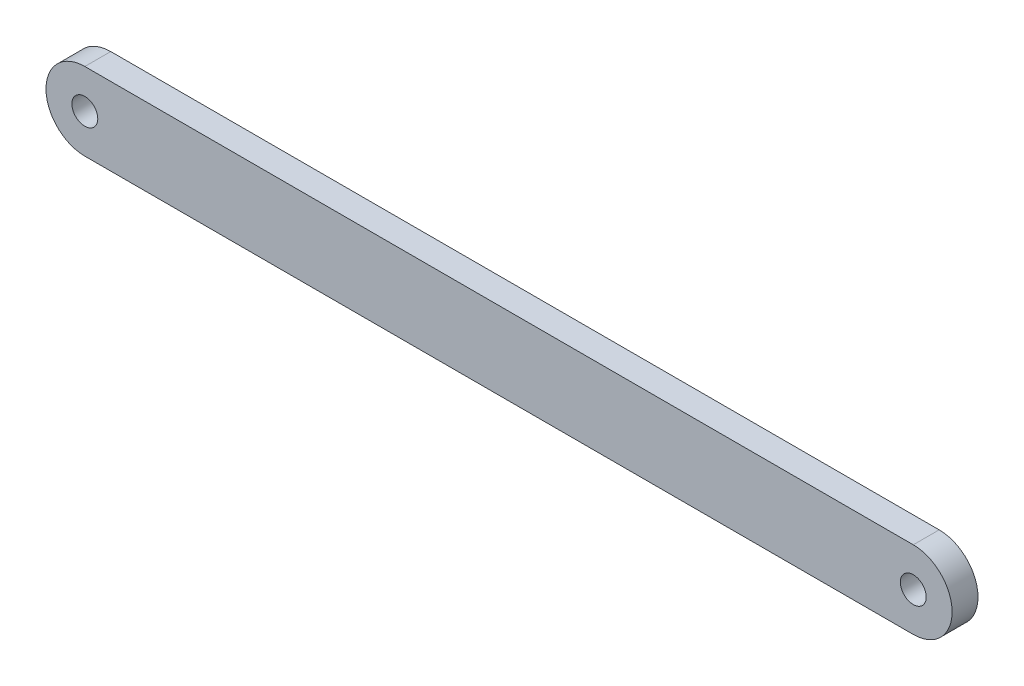
ISO-10303-21;
HEADER;
FILE_DESCRIPTION(('STEP AP214'),'2;1');
FILE_NAME('part.step','',(''),(''),'','','');
FILE_SCHEMA(('AUTOMOTIVE_DESIGN { 1 0 10303 214 1 1 1 1 }'));
ENDSEC;
DATA;
#1=APPLICATION_CONTEXT('core data for automotive mechanical design processes');
#2=APPLICATION_PROTOCOL_DEFINITION('international standard','automotive_design',2000,#1);
#3=PRODUCT_CONTEXT('',#1,'mechanical');
#4=PRODUCT('Part','Part','',(#3));
#5=PRODUCT_RELATED_PRODUCT_CATEGORY('part','',(#4));
#6=PRODUCT_DEFINITION_FORMATION('','',#4);
#7=PRODUCT_DEFINITION_CONTEXT('part definition',#1,'design');
#8=PRODUCT_DEFINITION('design','',#6,#7);
#9=PRODUCT_DEFINITION_SHAPE('','',#8);
#10=(LENGTH_UNIT() NAMED_UNIT(*) SI_UNIT(.MILLI.,.METRE.));
#11=(NAMED_UNIT(*) PLANE_ANGLE_UNIT() SI_UNIT($,.RADIAN.));
#12=(NAMED_UNIT(*) SI_UNIT($,.STERADIAN.) SOLID_ANGLE_UNIT());
#13=UNCERTAINTY_MEASURE_WITH_UNIT(LENGTH_MEASURE(1.E-05),#10,'distance_accuracy_value','');
#14=(GEOMETRIC_REPRESENTATION_CONTEXT(3) GLOBAL_UNCERTAINTY_ASSIGNED_CONTEXT((#13)) GLOBAL_UNIT_ASSIGNED_CONTEXT((#10,
#11,#12)) REPRESENTATION_CONTEXT('',''));
#15=CARTESIAN_POINT('',(0.,0.,0.));
#16=DIRECTION('',(0.,0.,1.));
#17=DIRECTION('',(1.,0.,0.));
#18=AXIS2_PLACEMENT_3D('',#15,#16,#17);
#19=CARTESIAN_POINT('',(0.,-4.76249999999999,3.17500000000001));
#20=DIRECTION('',(0.,1.,0.));
#21=DIRECTION('',(-1.,0.,0.));
#22=AXIS2_PLACEMENT_3D('',#19,#20,#21);
#23=PLANE('',#22);
#24=DIRECTION('',(1.,0.,0.));
#25=VECTOR('',#24,1.);
#26=CARTESIAN_POINT('',(0.,-4.76249999999999,0.));
#27=LINE('',#26,#25);
#28=CARTESIAN_POINT('',(0.,-4.76249999999999,0.));
#29=VERTEX_POINT('',#28);
#30=CARTESIAN_POINT('',(101.6,-4.76250000000027,0.));
#31=VERTEX_POINT('',#30);
#32=EDGE_CURVE('E105',#29,#31,#27,.T.);
#33=ORIENTED_EDGE('',*,*,#32,.T.);
#34=DIRECTION('',(0.,0.,-1.));
#35=VECTOR('',#34,1.);
#36=CARTESIAN_POINT('',(101.6,-4.76250000000027,3.17500000000001));
#37=LINE('',#36,#35);
#38=CARTESIAN_POINT('',(101.6,-4.76250000000027,3.17500000000001));
#39=VERTEX_POINT('',#38);
#40=EDGE_CURVE('E11',#39,#31,#37,.T.);
#41=ORIENTED_EDGE('',*,*,#40,.F.);
#42=DIRECTION('',(1.,0.,0.));
#43=VECTOR('',#42,1.);
#44=CARTESIAN_POINT('',(0.,-4.76249999999999,3.17500000000001));
#45=LINE('',#44,#43);
#46=CARTESIAN_POINT('',(0.,-4.76249999999999,3.17500000000001));
#47=VERTEX_POINT('',#46);
#48=EDGE_CURVE('E84',#47,#39,#45,.T.);
#49=ORIENTED_EDGE('',*,*,#48,.F.);
#50=DIRECTION('',(0.,0.,-1.));
#51=VECTOR('',#50,1.);
#52=CARTESIAN_POINT('',(0.,-4.76249999999999,3.17500000000001));
#53=LINE('',#52,#51);
#54=EDGE_CURVE('E104',#47,#29,#53,.T.);
#55=ORIENTED_EDGE('',*,*,#54,.T.);
#56=EDGE_LOOP('',(#33,#41,#49,#55));
#57=FACE_BOUND('',#56,.T.);
#58=ADVANCED_FACE('F36',(#57),#23,.F.);
#59=CARTESIAN_POINT('',(101.6,0.,3.17500000000001));
#60=DIRECTION('',(0.,0.,-1.));
#61=DIRECTION('',(-1.,0.,0.));
#62=AXIS2_PLACEMENT_3D('',#59,#60,#61);
#63=CYLINDRICAL_SURFACE('',#62,4.7625);
#64=CARTESIAN_POINT('',(101.6,0.,0.));
#65=DIRECTION('',(0.,0.,1.));
#66=DIRECTION('',(1.,0.,0.));
#67=AXIS2_PLACEMENT_3D('',#64,#65,#66);
#68=CIRCLE('',#67,4.7625);
#69=CARTESIAN_POINT('',(101.6,4.76250000000003,0.));
#70=VERTEX_POINT('',#69);
#71=EDGE_CURVE('E89',#31,#70,#68,.T.);
#72=ORIENTED_EDGE('',*,*,#71,.T.);
#73=DIRECTION('',(0.,0.,-1.));
#74=VECTOR('',#73,1.);
#75=CARTESIAN_POINT('',(101.6,4.76250000000003,3.17500000000001));
#76=LINE('',#75,#74);
#77=CARTESIAN_POINT('',(101.6,4.76250000000003,3.17500000000001));
#78=VERTEX_POINT('',#77);
#79=EDGE_CURVE('E44',#78,#70,#76,.T.);
#80=ORIENTED_EDGE('',*,*,#79,.F.);
#81=CARTESIAN_POINT('',(101.6,0.,3.17500000000001));
#82=DIRECTION('',(0.,0.,1.));
#83=DIRECTION('',(1.,0.,0.));
#84=AXIS2_PLACEMENT_3D('',#81,#82,#83);
#85=CIRCLE('',#84,4.7625);
#86=EDGE_CURVE('E78',#39,#78,#85,.T.);
#87=ORIENTED_EDGE('',*,*,#86,.F.);
#88=ORIENTED_EDGE('',*,*,#40,.T.);
#89=EDGE_LOOP('',(#72,#80,#87,#88));
#90=FACE_BOUND('',#89,.T.);
#91=ADVANCED_FACE('F88',(#90),#63,.T.);
#92=CARTESIAN_POINT('',(0.,4.76250000000002,3.17500000000001));
#93=DIRECTION('',(0.,1.,0.));
#94=DIRECTION('',(-1.,0.,0.));
#95=AXIS2_PLACEMENT_3D('',#92,#93,#94);
#96=PLANE('',#95);
#97=DIRECTION('',(1.,0.,0.));
#98=VECTOR('',#97,1.);
#99=CARTESIAN_POINT('',(0.,4.76250000000002,0.));
#100=LINE('',#99,#98);
#101=CARTESIAN_POINT('',(0.,4.76250000000002,0.));
#102=VERTEX_POINT('',#101);
#103=EDGE_CURVE('E109',#102,#70,#100,.T.);
#104=ORIENTED_EDGE('',*,*,#103,.F.);
#105=DIRECTION('',(0.,0.,-1.));
#106=VECTOR('',#105,1.);
#107=CARTESIAN_POINT('',(0.,4.76250000000002,3.17500000000001));
#108=LINE('',#107,#106);
#109=CARTESIAN_POINT('',(0.,4.76250000000002,3.17500000000001));
#110=VERTEX_POINT('',#109);
#111=EDGE_CURVE('E68',#110,#102,#108,.T.);
#112=ORIENTED_EDGE('',*,*,#111,.F.);
#113=DIRECTION('',(1.,0.,0.));
#114=VECTOR('',#113,1.);
#115=CARTESIAN_POINT('',(0.,4.76250000000002,3.17500000000001));
#116=LINE('',#115,#114);
#117=EDGE_CURVE('E82',#110,#78,#116,.T.);
#118=ORIENTED_EDGE('',*,*,#117,.T.);
#119=ORIENTED_EDGE('',*,*,#79,.T.);
#120=EDGE_LOOP('',(#104,#112,#118,#119));
#121=FACE_BOUND('',#120,.T.);
#122=ADVANCED_FACE('F93',(#121),#96,.T.);
#123=CARTESIAN_POINT('',(0.,0.,3.17500000000001));
#124=DIRECTION('',(0.,0.,-1.));
#125=DIRECTION('',(-1.,0.,0.));
#126=AXIS2_PLACEMENT_3D('',#123,#124,#125);
#127=CYLINDRICAL_SURFACE('',#126,1.5875);
#128=CARTESIAN_POINT('',(0.,0.,3.17500000000001));
#129=DIRECTION('',(0.,0.,1.));
#130=DIRECTION('',(1.,0.,0.));
#131=AXIS2_PLACEMENT_3D('',#128,#129,#130);
#132=CIRCLE('',#131,1.5875);
#133=CARTESIAN_POINT('',(1.5875,0.,3.17500000000001));
#134=VERTEX_POINT('',#133);
#135=EDGE_CURVE('E95',#134,#134,#132,.T.);
#136=ORIENTED_EDGE('',*,*,#135,.T.);
#137=EDGE_LOOP('',(#136));
#138=FACE_BOUND('',#137,.T.);
#139=CARTESIAN_POINT('',(0.,0.,0.));
#140=DIRECTION('',(0.,0.,1.));
#141=DIRECTION('',(1.,0.,0.));
#142=AXIS2_PLACEMENT_3D('',#139,#140,#141);
#143=CIRCLE('',#142,1.5875);
#144=CARTESIAN_POINT('',(1.5875,0.,0.));
#145=VERTEX_POINT('',#144);
#146=EDGE_CURVE('E112',#145,#145,#143,.T.);
#147=ORIENTED_EDGE('',*,*,#146,.F.);
#148=EDGE_LOOP('',(#147));
#149=FACE_BOUND('',#148,.T.);
#150=ADVANCED_FACE('F140',(#138,#149),#127,.F.);
#151=CARTESIAN_POINT('',(0.,0.,3.17500000000001));
#152=DIRECTION('',(0.,0.,-1.));
#153=DIRECTION('',(-1.,0.,0.));
#154=AXIS2_PLACEMENT_3D('',#151,#152,#153);
#155=CYLINDRICAL_SURFACE('',#154,4.7625);
#156=CARTESIAN_POINT('',(0.,0.,0.));
#157=DIRECTION('',(0.,0.,1.));
#158=DIRECTION('',(1.,0.,0.));
#159=AXIS2_PLACEMENT_3D('',#156,#157,#158);
#160=CIRCLE('',#159,4.7625);
#161=EDGE_CURVE('E71',#102,#29,#160,.T.);
#162=ORIENTED_EDGE('',*,*,#161,.T.);
#163=ORIENTED_EDGE('',*,*,#54,.F.);
#164=CARTESIAN_POINT('',(0.,0.,3.17500000000001));
#165=DIRECTION('',(0.,0.,1.));
#166=DIRECTION('',(1.,0.,0.));
#167=AXIS2_PLACEMENT_3D('',#164,#165,#166);
#168=CIRCLE('',#167,4.7625);
#169=EDGE_CURVE('E52',#110,#47,#168,.T.);
#170=ORIENTED_EDGE('',*,*,#169,.F.);
#171=ORIENTED_EDGE('',*,*,#111,.T.);
#172=EDGE_LOOP('',(#162,#163,#170,#171));
#173=FACE_BOUND('',#172,.T.);
#174=ADVANCED_FACE('F132',(#173),#155,.T.);
#175=CARTESIAN_POINT('',(101.6,0.,3.17500000000001));
#176=DIRECTION('',(0.,0.,-1.));
#177=DIRECTION('',(-1.,0.,0.));
#178=AXIS2_PLACEMENT_3D('',#175,#176,#177);
#179=CYLINDRICAL_SURFACE('',#178,1.58749999999999);
#180=CARTESIAN_POINT('',(101.6,0.,3.17500000000001));
#181=DIRECTION('',(0.,0.,1.));
#182=DIRECTION('',(1.,0.,0.));
#183=AXIS2_PLACEMENT_3D('',#180,#181,#182);
#184=CIRCLE('',#183,1.58749999999999);
#185=CARTESIAN_POINT('',(103.1875,0.,3.17500000000001));
#186=VERTEX_POINT('',#185);
#187=EDGE_CURVE('E101',#186,#186,#184,.T.);
#188=ORIENTED_EDGE('',*,*,#187,.T.);
#189=EDGE_LOOP('',(#188));
#190=FACE_BOUND('',#189,.T.);
#191=CARTESIAN_POINT('',(101.6,0.,0.));
#192=DIRECTION('',(0.,0.,1.));
#193=DIRECTION('',(1.,0.,0.));
#194=AXIS2_PLACEMENT_3D('',#191,#192,#193);
#195=CIRCLE('',#194,1.58749999999999);
#196=CARTESIAN_POINT('',(103.1875,0.,0.));
#197=VERTEX_POINT('',#196);
#198=EDGE_CURVE('E115',#197,#197,#195,.T.);
#199=ORIENTED_EDGE('',*,*,#198,.F.);
#200=EDGE_LOOP('',(#199));
#201=FACE_BOUND('',#200,.T.);
#202=ADVANCED_FACE('F130',(#190,#201),#179,.F.);
#203=CARTESIAN_POINT('',(0.,0.,3.17500000000001));
#204=DIRECTION('',(0.,0.,1.));
#205=DIRECTION('',(1.,0.,0.));
#206=AXIS2_PLACEMENT_3D('',#203,#204,#205);
#207=PLANE('',#206);
#208=ORIENTED_EDGE('',*,*,#48,.T.);
#209=ORIENTED_EDGE('',*,*,#86,.T.);
#210=ORIENTED_EDGE('',*,*,#117,.F.);
#211=ORIENTED_EDGE('',*,*,#169,.T.);
#212=EDGE_LOOP('',(#208,#209,#210,#211));
#213=FACE_BOUND('',#212,.T.);
#214=ORIENTED_EDGE('',*,*,#135,.F.);
#215=EDGE_LOOP('',(#214));
#216=FACE_BOUND('',#215,.T.);
#217=ORIENTED_EDGE('',*,*,#187,.F.);
#218=EDGE_LOOP('',(#217));
#219=FACE_BOUND('',#218,.T.);
#220=ADVANCED_FACE('F79',(#213,#216,#219),#207,.T.);
#221=CARTESIAN_POINT('',(0.,0.,0.));
#222=DIRECTION('',(0.,0.,1.));
#223=DIRECTION('',(1.,0.,0.));
#224=AXIS2_PLACEMENT_3D('',#221,#222,#223);
#225=PLANE('',#224);
#226=ORIENTED_EDGE('',*,*,#32,.F.);
#227=ORIENTED_EDGE('',*,*,#161,.F.);
#228=ORIENTED_EDGE('',*,*,#103,.T.);
#229=ORIENTED_EDGE('',*,*,#71,.F.);
#230=EDGE_LOOP('',(#226,#227,#228,#229));
#231=FACE_BOUND('',#230,.T.);
#232=ORIENTED_EDGE('',*,*,#146,.T.);
#233=EDGE_LOOP('',(#232));
#234=FACE_BOUND('',#233,.T.);
#235=ORIENTED_EDGE('',*,*,#198,.T.);
#236=EDGE_LOOP('',(#235));
#237=FACE_BOUND('',#236,.T.);
#238=ADVANCED_FACE('F122',(#231,#234,#237),#225,.F.);
#239=CLOSED_SHELL('',(#58,#91,#122,#150,#174,#202,#220,#238));
#240=MANIFOLD_SOLID_BREP('B2',#239);
#241=ADVANCED_BREP_SHAPE_REPRESENTATION('',(#18,#240),#14);
#242=SHAPE_DEFINITION_REPRESENTATION(#9,#241);
ENDSEC;
END-ISO-10303-21;
